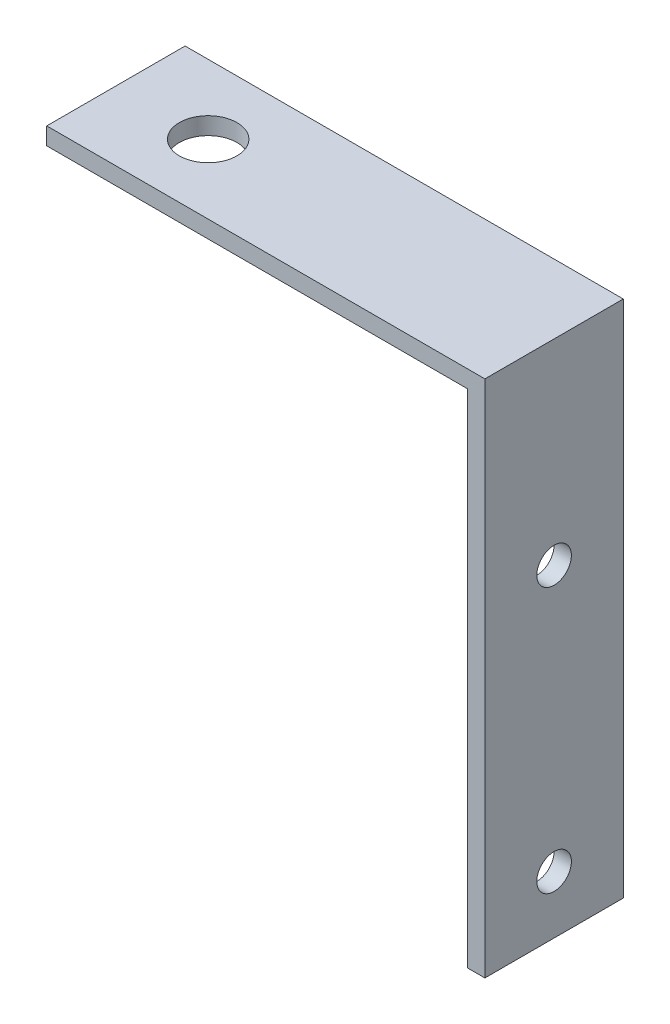
ISO-10303-21;
HEADER;
FILE_DESCRIPTION(('STEP AP214'),'2;1');
FILE_NAME('part.step','',(''),(''),'','','');
FILE_SCHEMA(('AUTOMOTIVE_DESIGN { 1 0 10303 214 1 1 1 1 }'));
ENDSEC;
DATA;
#1=APPLICATION_CONTEXT('core data for automotive mechanical design processes');
#2=APPLICATION_PROTOCOL_DEFINITION('international standard','automotive_design',2000,#1);
#3=PRODUCT_CONTEXT('',#1,'mechanical');
#4=PRODUCT('Part','Part','',(#3));
#5=PRODUCT_RELATED_PRODUCT_CATEGORY('part','',(#4));
#6=PRODUCT_DEFINITION_FORMATION('','',#4);
#7=PRODUCT_DEFINITION_CONTEXT('part definition',#1,'design');
#8=PRODUCT_DEFINITION('design','',#6,#7);
#9=PRODUCT_DEFINITION_SHAPE('','',#8);
#10=(LENGTH_UNIT() NAMED_UNIT(*) SI_UNIT(.MILLI.,.METRE.));
#11=(NAMED_UNIT(*) PLANE_ANGLE_UNIT() SI_UNIT($,.RADIAN.));
#12=(NAMED_UNIT(*) SI_UNIT($,.STERADIAN.) SOLID_ANGLE_UNIT());
#13=UNCERTAINTY_MEASURE_WITH_UNIT(LENGTH_MEASURE(1.E-05),#10,'distance_accuracy_value','');
#14=(GEOMETRIC_REPRESENTATION_CONTEXT(3) GLOBAL_UNCERTAINTY_ASSIGNED_CONTEXT((#13)) GLOBAL_UNIT_ASSIGNED_CONTEXT((#10,
#11,#12)) REPRESENTATION_CONTEXT('',''));
#15=CARTESIAN_POINT('',(0.,0.,0.));
#16=DIRECTION('',(0.,0.,1.));
#17=DIRECTION('',(1.,0.,0.));
#18=AXIS2_PLACEMENT_3D('',#15,#16,#17);
#19=CARTESIAN_POINT('',(0.,-1.5,-6.));
#20=DIRECTION('',(0.,0.,1.));
#21=DIRECTION('',(1.,0.,0.));
#22=AXIS2_PLACEMENT_3D('',#19,#20,#21);
#23=PLANE('',#22);
#24=DIRECTION('',(1.,0.,0.));
#25=VECTOR('',#24,1.);
#26=CARTESIAN_POINT('',(0.,0.,-6.));
#27=LINE('',#26,#25);
#28=CARTESIAN_POINT('',(-19.,0.,-6.));
#29=VERTEX_POINT('',#28);
#30=CARTESIAN_POINT('',(19.,0.,-6.));
#31=VERTEX_POINT('',#30);
#32=EDGE_CURVE('E116',#29,#31,#27,.T.);
#33=ORIENTED_EDGE('',*,*,#32,.T.);
#34=DIRECTION('',(0.,1.,0.));
#35=VECTOR('',#34,1.);
#36=CARTESIAN_POINT('',(19.,-45.,-6.));
#37=LINE('',#36,#35);
#38=CARTESIAN_POINT('',(19.,-45.,-6.));
#39=VERTEX_POINT('',#38);
#40=EDGE_CURVE('E124',#39,#31,#37,.T.);
#41=ORIENTED_EDGE('',*,*,#40,.F.);
#42=DIRECTION('',(1.,0.,0.));
#43=VECTOR('',#42,1.);
#44=CARTESIAN_POINT('',(0.,-45.,-6.));
#45=LINE('',#44,#43);
#46=CARTESIAN_POINT('',(17.5,-45.,-6.));
#47=VERTEX_POINT('',#46);
#48=EDGE_CURVE('E132',#47,#39,#45,.T.);
#49=ORIENTED_EDGE('',*,*,#48,.F.);
#50=DIRECTION('',(0.,1.,0.));
#51=VECTOR('',#50,1.);
#52=CARTESIAN_POINT('',(17.5,-45.,-6.));
#53=LINE('',#52,#51);
#54=CARTESIAN_POINT('',(17.5,-1.50000000000002,-6.));
#55=VERTEX_POINT('',#54);
#56=EDGE_CURVE('E101',#47,#55,#53,.T.);
#57=ORIENTED_EDGE('',*,*,#56,.T.);
#58=DIRECTION('',(1.,0.,0.));
#59=VECTOR('',#58,1.);
#60=CARTESIAN_POINT('',(0.,-1.5,-6.));
#61=LINE('',#60,#59);
#62=CARTESIAN_POINT('',(-19.,-1.5,-6.));
#63=VERTEX_POINT('',#62);
#64=EDGE_CURVE('E90',#63,#55,#61,.T.);
#65=ORIENTED_EDGE('',*,*,#64,.F.);
#66=DIRECTION('',(0.,1.,0.));
#67=VECTOR('',#66,1.);
#68=CARTESIAN_POINT('',(-19.,-1.5,-6.));
#69=LINE('',#68,#67);
#70=EDGE_CURVE('E44',#63,#29,#69,.T.);
#71=ORIENTED_EDGE('',*,*,#70,.T.);
#72=EDGE_LOOP('',(#33,#41,#49,#57,#65,#71));
#73=FACE_BOUND('',#72,.T.);
#74=ADVANCED_FACE('F41',(#73),#23,.F.);
#75=CARTESIAN_POINT('',(0.,-1.5,6.));
#76=DIRECTION('',(0.,0.,1.));
#77=DIRECTION('',(1.,0.,0.));
#78=AXIS2_PLACEMENT_3D('',#75,#76,#77);
#79=PLANE('',#78);
#80=DIRECTION('',(1.,0.,0.));
#81=VECTOR('',#80,1.);
#82=CARTESIAN_POINT('',(0.,0.,6.));
#83=LINE('',#82,#81);
#84=CARTESIAN_POINT('',(-19.,0.,6.));
#85=VERTEX_POINT('',#84);
#86=CARTESIAN_POINT('',(19.,0.,6.));
#87=VERTEX_POINT('',#86);
#88=EDGE_CURVE('E103',#85,#87,#83,.T.);
#89=ORIENTED_EDGE('',*,*,#88,.F.);
#90=DIRECTION('',(0.,1.,0.));
#91=VECTOR('',#90,1.);
#92=CARTESIAN_POINT('',(-19.,-1.5,6.));
#93=LINE('',#92,#91);
#94=CARTESIAN_POINT('',(-19.,-1.5,6.));
#95=VERTEX_POINT('',#94);
#96=EDGE_CURVE('E11',#95,#85,#93,.T.);
#97=ORIENTED_EDGE('',*,*,#96,.F.);
#98=DIRECTION('',(1.,0.,0.));
#99=VECTOR('',#98,1.);
#100=CARTESIAN_POINT('',(0.,-1.5,6.));
#101=LINE('',#100,#99);
#102=CARTESIAN_POINT('',(17.5,-1.5,6.));
#103=VERTEX_POINT('',#102);
#104=EDGE_CURVE('E92',#95,#103,#101,.T.);
#105=ORIENTED_EDGE('',*,*,#104,.T.);
#106=DIRECTION('',(0.,1.,0.));
#107=VECTOR('',#106,1.);
#108=CARTESIAN_POINT('',(17.5,-45.,6.));
#109=LINE('',#108,#107);
#110=CARTESIAN_POINT('',(17.5,-45.,6.));
#111=VERTEX_POINT('',#110);
#112=EDGE_CURVE('E58',#111,#103,#109,.T.);
#113=ORIENTED_EDGE('',*,*,#112,.F.);
#114=DIRECTION('',(1.,0.,0.));
#115=VECTOR('',#114,1.);
#116=CARTESIAN_POINT('',(0.,-45.,6.));
#117=LINE('',#116,#115);
#118=CARTESIAN_POINT('',(19.,-45.,6.));
#119=VERTEX_POINT('',#118);
#120=EDGE_CURVE('E140',#111,#119,#117,.T.);
#121=ORIENTED_EDGE('',*,*,#120,.T.);
#122=DIRECTION('',(0.,1.,0.));
#123=VECTOR('',#122,1.);
#124=CARTESIAN_POINT('',(19.,-45.,6.));
#125=LINE('',#124,#123);
#126=EDGE_CURVE('E109',#119,#87,#125,.T.);
#127=ORIENTED_EDGE('',*,*,#126,.T.);
#128=EDGE_LOOP('',(#89,#97,#105,#113,#121,#127));
#129=FACE_BOUND('',#128,.T.);
#130=ADVANCED_FACE('F199',(#129),#79,.T.);
#131=CARTESIAN_POINT('',(-19.,-1.5,0.));
#132=DIRECTION('',(1.,0.,0.));
#133=DIRECTION('',(0.,0.,-1.));
#134=AXIS2_PLACEMENT_3D('',#131,#132,#133);
#135=PLANE('',#134);
#136=DIRECTION('',(0.,0.,-1.));
#137=VECTOR('',#136,1.);
#138=CARTESIAN_POINT('',(-19.,0.,0.));
#139=LINE('',#138,#137);
#140=EDGE_CURVE('E70',#85,#29,#139,.T.);
#141=ORIENTED_EDGE('',*,*,#140,.T.);
#142=ORIENTED_EDGE('',*,*,#70,.F.);
#143=DIRECTION('',(0.,0.,-1.));
#144=VECTOR('',#143,1.);
#145=CARTESIAN_POINT('',(-19.,-1.5,0.));
#146=LINE('',#145,#144);
#147=EDGE_CURVE('E87',#95,#63,#146,.T.);
#148=ORIENTED_EDGE('',*,*,#147,.F.);
#149=ORIENTED_EDGE('',*,*,#96,.T.);
#150=EDGE_LOOP('',(#141,#142,#148,#149));
#151=FACE_BOUND('',#150,.T.);
#152=ADVANCED_FACE('F95',(#151),#135,.F.);
#153=CARTESIAN_POINT('',(0.,-1.5,0.));
#154=DIRECTION('',(0.,1.,0.));
#155=DIRECTION('',(0.,0.,1.));
#156=AXIS2_PLACEMENT_3D('',#153,#154,#155);
#157=PLANE('',#156);
#158=CARTESIAN_POINT('',(-11.,-1.5,0.));
#159=DIRECTION('',(0.,1.,0.));
#160=DIRECTION('',(0.,0.,1.));
#161=AXIS2_PLACEMENT_3D('',#158,#159,#160);
#162=CIRCLE('',#161,2.5);
#163=CARTESIAN_POINT('',(-11.,-1.5,2.5));
#164=VERTEX_POINT('',#163);
#165=EDGE_CURVE('E164',#164,#164,#162,.T.);
#166=ORIENTED_EDGE('',*,*,#165,.T.);
#167=EDGE_LOOP('',(#166));
#168=FACE_BOUND('',#167,.T.);
#169=ORIENTED_EDGE('',*,*,#64,.T.);
#170=DIRECTION('',(0.,0.,1.));
#171=VECTOR('',#170,1.);
#172=CARTESIAN_POINT('',(17.5,-1.5,0.));
#173=LINE('',#172,#171);
#174=EDGE_CURVE('E75',#55,#103,#173,.T.);
#175=ORIENTED_EDGE('',*,*,#174,.T.);
#176=ORIENTED_EDGE('',*,*,#104,.F.);
#177=ORIENTED_EDGE('',*,*,#147,.T.);
#178=EDGE_LOOP('',(#169,#175,#176,#177));
#179=FACE_BOUND('',#178,.T.);
#180=ADVANCED_FACE('F88',(#168,#179),#157,.F.);
#181=CARTESIAN_POINT('',(0.,0.,0.));
#182=DIRECTION('',(0.,1.,0.));
#183=DIRECTION('',(0.,0.,1.));
#184=AXIS2_PLACEMENT_3D('',#181,#182,#183);
#185=PLANE('',#184);
#186=CARTESIAN_POINT('',(-11.,0.,0.));
#187=DIRECTION('',(0.,1.,0.));
#188=DIRECTION('',(0.,0.,1.));
#189=AXIS2_PLACEMENT_3D('',#186,#187,#188);
#190=CIRCLE('',#189,2.5);
#191=CARTESIAN_POINT('',(-11.,0.,2.5));
#192=VERTEX_POINT('',#191);
#193=EDGE_CURVE('E168',#192,#192,#190,.T.);
#194=ORIENTED_EDGE('',*,*,#193,.F.);
#195=EDGE_LOOP('',(#194));
#196=FACE_BOUND('',#195,.T.);
#197=ORIENTED_EDGE('',*,*,#32,.F.);
#198=ORIENTED_EDGE('',*,*,#140,.F.);
#199=ORIENTED_EDGE('',*,*,#88,.T.);
#200=DIRECTION('',(0.,0.,-1.));
#201=VECTOR('',#200,1.);
#202=CARTESIAN_POINT('',(19.,0.,0.));
#203=LINE('',#202,#201);
#204=EDGE_CURVE('E144',#87,#31,#203,.T.);
#205=ORIENTED_EDGE('',*,*,#204,.T.);
#206=EDGE_LOOP('',(#197,#198,#199,#205));
#207=FACE_BOUND('',#206,.T.);
#208=ADVANCED_FACE('F177',(#196,#207),#185,.T.);
#209=CARTESIAN_POINT('',(17.5,-45.,0.));
#210=DIRECTION('',(-1.,0.,0.));
#211=DIRECTION('',(0.,0.,1.));
#212=AXIS2_PLACEMENT_3D('',#209,#210,#211);
#213=PLANE('',#212);
#214=CARTESIAN_POINT('',(17.5,-40.,0.));
#215=DIRECTION('',(-1.,0.,0.));
#216=DIRECTION('',(0.,0.,1.));
#217=AXIS2_PLACEMENT_3D('',#214,#215,#216);
#218=CIRCLE('',#217,1.5);
#219=CARTESIAN_POINT('',(17.5,-40.,1.5));
#220=VERTEX_POINT('',#219);
#221=EDGE_CURVE('E148',#220,#220,#218,.T.);
#222=ORIENTED_EDGE('',*,*,#221,.F.);
#223=EDGE_LOOP('',(#222));
#224=FACE_BOUND('',#223,.T.);
#225=CARTESIAN_POINT('',(17.5,-17.,0.));
#226=DIRECTION('',(-1.,0.,0.));
#227=DIRECTION('',(0.,0.,1.));
#228=AXIS2_PLACEMENT_3D('',#225,#226,#227);
#229=CIRCLE('',#228,1.5);
#230=CARTESIAN_POINT('',(17.5,-17.,1.5));
#231=VERTEX_POINT('',#230);
#232=EDGE_CURVE('E152',#231,#231,#229,.T.);
#233=ORIENTED_EDGE('',*,*,#232,.F.);
#234=EDGE_LOOP('',(#233));
#235=FACE_BOUND('',#234,.T.);
#236=ORIENTED_EDGE('',*,*,#174,.F.);
#237=ORIENTED_EDGE('',*,*,#56,.F.);
#238=DIRECTION('',(0.,0.,1.));
#239=VECTOR('',#238,1.);
#240=CARTESIAN_POINT('',(17.5,-45.,0.));
#241=LINE('',#240,#239);
#242=EDGE_CURVE('E130',#47,#111,#241,.T.);
#243=ORIENTED_EDGE('',*,*,#242,.T.);
#244=ORIENTED_EDGE('',*,*,#112,.T.);
#245=EDGE_LOOP('',(#236,#237,#243,#244));
#246=FACE_BOUND('',#245,.T.);
#247=ADVANCED_FACE('F180',(#224,#235,#246),#213,.T.);
#248=CARTESIAN_POINT('',(19.,-45.,0.));
#249=DIRECTION('',(1.,0.,0.));
#250=DIRECTION('',(0.,0.,-1.));
#251=AXIS2_PLACEMENT_3D('',#248,#249,#250);
#252=PLANE('',#251);
#253=CARTESIAN_POINT('',(19.,-40.,0.));
#254=DIRECTION('',(1.,0.,0.));
#255=DIRECTION('',(0.,0.,-1.));
#256=AXIS2_PLACEMENT_3D('',#253,#254,#255);
#257=CIRCLE('',#256,1.5);
#258=CARTESIAN_POINT('',(19.,-40.,-1.5));
#259=VERTEX_POINT('',#258);
#260=EDGE_CURVE('E156',#259,#259,#257,.T.);
#261=ORIENTED_EDGE('',*,*,#260,.F.);
#262=EDGE_LOOP('',(#261));
#263=FACE_BOUND('',#262,.T.);
#264=CARTESIAN_POINT('',(19.,-17.,0.));
#265=DIRECTION('',(1.,0.,0.));
#266=DIRECTION('',(0.,0.,-1.));
#267=AXIS2_PLACEMENT_3D('',#264,#265,#266);
#268=CIRCLE('',#267,1.5);
#269=CARTESIAN_POINT('',(19.,-17.,-1.5));
#270=VERTEX_POINT('',#269);
#271=EDGE_CURVE('E160',#270,#270,#268,.T.);
#272=ORIENTED_EDGE('',*,*,#271,.F.);
#273=EDGE_LOOP('',(#272));
#274=FACE_BOUND('',#273,.T.);
#275=ORIENTED_EDGE('',*,*,#204,.F.);
#276=ORIENTED_EDGE('',*,*,#126,.F.);
#277=DIRECTION('',(0.,0.,-1.));
#278=VECTOR('',#277,1.);
#279=CARTESIAN_POINT('',(19.,-45.,0.));
#280=LINE('',#279,#278);
#281=EDGE_CURVE('E136',#119,#39,#280,.T.);
#282=ORIENTED_EDGE('',*,*,#281,.T.);
#283=ORIENTED_EDGE('',*,*,#40,.T.);
#284=EDGE_LOOP('',(#275,#276,#282,#283));
#285=FACE_BOUND('',#284,.T.);
#286=ADVANCED_FACE('F189',(#263,#274,#285),#252,.T.);
#287=CARTESIAN_POINT('',(0.,-45.,0.));
#288=DIRECTION('',(0.,1.,0.));
#289=DIRECTION('',(0.,0.,1.));
#290=AXIS2_PLACEMENT_3D('',#287,#288,#289);
#291=PLANE('',#290);
#292=ORIENTED_EDGE('',*,*,#120,.F.);
#293=ORIENTED_EDGE('',*,*,#242,.F.);
#294=ORIENTED_EDGE('',*,*,#48,.T.);
#295=ORIENTED_EDGE('',*,*,#281,.F.);
#296=EDGE_LOOP('',(#292,#293,#294,#295));
#297=FACE_BOUND('',#296,.T.);
#298=ADVANCED_FACE('F195',(#297),#291,.F.);
#299=CARTESIAN_POINT('',(-19.,-17.,0.));
#300=DIRECTION('',(1.,0.,0.));
#301=DIRECTION('',(0.,0.,-1.));
#302=AXIS2_PLACEMENT_3D('',#299,#300,#301);
#303=CYLINDRICAL_SURFACE('',#302,1.5);
#304=ORIENTED_EDGE('',*,*,#232,.T.);
#305=EDGE_LOOP('',(#304));
#306=FACE_BOUND('',#305,.T.);
#307=ORIENTED_EDGE('',*,*,#271,.T.);
#308=EDGE_LOOP('',(#307));
#309=FACE_BOUND('',#308,.T.);
#310=ADVANCED_FACE('F232',(#306,#309),#303,.F.);
#311=CARTESIAN_POINT('',(-19.,-40.,0.));
#312=DIRECTION('',(1.,0.,0.));
#313=DIRECTION('',(0.,0.,-1.));
#314=AXIS2_PLACEMENT_3D('',#311,#312,#313);
#315=CYLINDRICAL_SURFACE('',#314,1.5);
#316=ORIENTED_EDGE('',*,*,#221,.T.);
#317=EDGE_LOOP('',(#316));
#318=FACE_BOUND('',#317,.T.);
#319=ORIENTED_EDGE('',*,*,#260,.T.);
#320=EDGE_LOOP('',(#319));
#321=FACE_BOUND('',#320,.T.);
#322=ADVANCED_FACE('F227',(#318,#321),#315,.F.);
#323=CARTESIAN_POINT('',(-11.,-30.,0.));
#324=DIRECTION('',(0.,1.,0.));
#325=DIRECTION('',(0.,0.,1.));
#326=AXIS2_PLACEMENT_3D('',#323,#324,#325);
#327=CYLINDRICAL_SURFACE('',#326,2.5);
#328=ORIENTED_EDGE('',*,*,#193,.T.);
#329=EDGE_LOOP('',(#328));
#330=FACE_BOUND('',#329,.T.);
#331=ORIENTED_EDGE('',*,*,#165,.F.);
#332=EDGE_LOOP('',(#331));
#333=FACE_BOUND('',#332,.T.);
#334=ADVANCED_FACE('F174',(#330,#333),#327,.F.);
#335=CLOSED_SHELL('',(#74,#130,#152,#180,#208,#247,#286,#298,#310,#322,#334));
#336=MANIFOLD_SOLID_BREP('B2',#335);
#337=ADVANCED_BREP_SHAPE_REPRESENTATION('',(#18,#336),#14);
#338=SHAPE_DEFINITION_REPRESENTATION(#9,#337);
ENDSEC;
END-ISO-10303-21;
